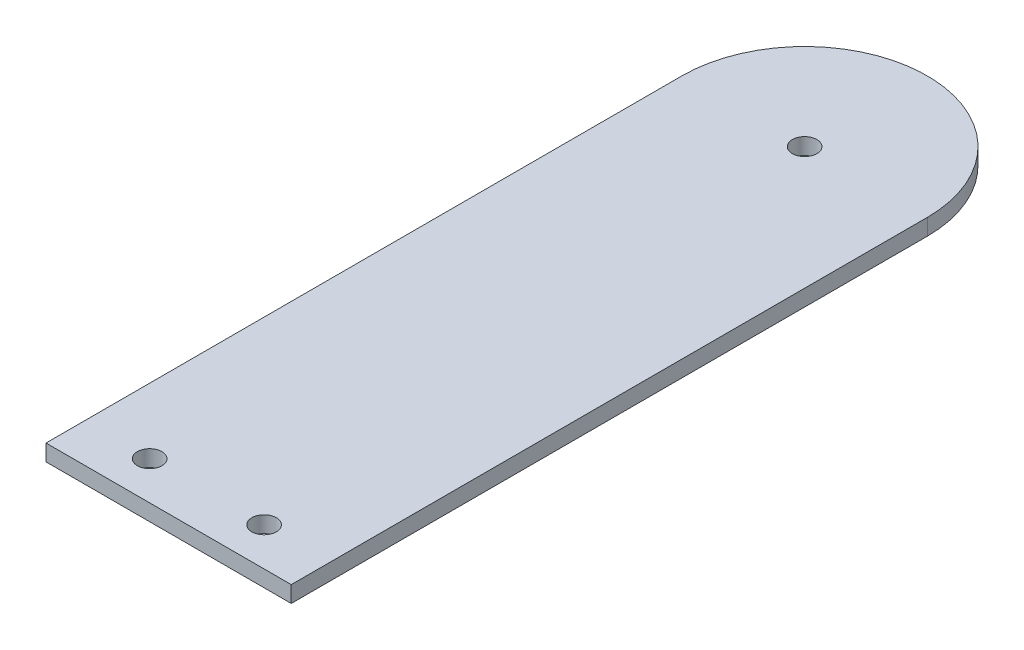
ISO-10303-21;
HEADER;
FILE_DESCRIPTION(('STEP AP214'),'2;1');
FILE_NAME('part.step','',(''),(''),'','','');
FILE_SCHEMA(('AUTOMOTIVE_DESIGN { 1 0 10303 214 1 1 1 1 }'));
ENDSEC;
DATA;
#1=APPLICATION_CONTEXT('core data for automotive mechanical design processes');
#2=APPLICATION_PROTOCOL_DEFINITION('international standard','automotive_design',2000,#1);
#3=PRODUCT_CONTEXT('',#1,'mechanical');
#4=PRODUCT('Part','Part','',(#3));
#5=PRODUCT_RELATED_PRODUCT_CATEGORY('part','',(#4));
#6=PRODUCT_DEFINITION_FORMATION('','',#4);
#7=PRODUCT_DEFINITION_CONTEXT('part definition',#1,'design');
#8=PRODUCT_DEFINITION('design','',#6,#7);
#9=PRODUCT_DEFINITION_SHAPE('','',#8);
#10=(LENGTH_UNIT() NAMED_UNIT(*) SI_UNIT(.MILLI.,.METRE.));
#11=(NAMED_UNIT(*) PLANE_ANGLE_UNIT() SI_UNIT($,.RADIAN.));
#12=(NAMED_UNIT(*) SI_UNIT($,.STERADIAN.) SOLID_ANGLE_UNIT());
#13=UNCERTAINTY_MEASURE_WITH_UNIT(LENGTH_MEASURE(1.E-05),#10,'distance_accuracy_value','');
#14=(GEOMETRIC_REPRESENTATION_CONTEXT(3) GLOBAL_UNCERTAINTY_ASSIGNED_CONTEXT((#13)) GLOBAL_UNIT_ASSIGNED_CONTEXT((#10,
#11,#12)) REPRESENTATION_CONTEXT('',''));
#15=CARTESIAN_POINT('',(0.,0.,0.));
#16=DIRECTION('',(0.,0.,1.));
#17=DIRECTION('',(1.,0.,0.));
#18=AXIS2_PLACEMENT_3D('',#15,#16,#17);
#19=CARTESIAN_POINT('',(-2.62522791540278,2.,-48.1827211912994));
#20=DIRECTION('',(0.,1.,0.));
#21=DIRECTION('',(0.,0.,1.));
#22=AXIS2_PLACEMENT_3D('',#19,#20,#21);
#23=PLANE('',#22);
#24=CARTESIAN_POINT('',(4.37477208459723,2.,24.9379456374754));
#25=DIRECTION('',(0.,1.,0.));
#26=DIRECTION('',(0.,0.,1.));
#27=AXIS2_PLACEMENT_3D('',#24,#25,#26);
#28=CIRCLE('',#27,1.5);
#29=CARTESIAN_POINT('',(4.37477208459723,2.,26.4379456374754));
#30=VERTEX_POINT('',#29);
#31=EDGE_CURVE('E117',#30,#30,#28,.T.);
#32=ORIENTED_EDGE('',*,*,#31,.F.);
#33=EDGE_LOOP('',(#32));
#34=FACE_BOUND('',#33,.T.);
#35=DIRECTION('',(0.,0.,1.));
#36=VECTOR('',#35,1.);
#37=CARTESIAN_POINT('',(-17.6252279154028,2.,29.6172788087006));
#38=LINE('',#37,#36);
#39=CARTESIAN_POINT('',(-17.6252279154028,2.,-48.1827211912994));
#40=VERTEX_POINT('',#39);
#41=CARTESIAN_POINT('',(-17.6252279154028,2.,29.6172788087006));
#42=VERTEX_POINT('',#41);
#43=EDGE_CURVE('E87',#40,#42,#38,.T.);
#44=ORIENTED_EDGE('',*,*,#43,.T.);
#45=DIRECTION('',(1.,0.,0.));
#46=VECTOR('',#45,1.);
#47=CARTESIAN_POINT('',(-17.6252279154028,2.,29.6172788087006));
#48=LINE('',#47,#46);
#49=CARTESIAN_POINT('',(12.3747720845972,2.,29.6172788087006));
#50=VERTEX_POINT('',#49);
#51=EDGE_CURVE('E82',#42,#50,#48,.T.);
#52=ORIENTED_EDGE('',*,*,#51,.T.);
#53=DIRECTION('',(0.,0.,-1.));
#54=VECTOR('',#53,1.);
#55=CARTESIAN_POINT('',(12.3747720845972,2.,29.6172788087006));
#56=LINE('',#55,#54);
#57=CARTESIAN_POINT('',(12.3747720845972,2.,-48.1827211912994));
#58=VERTEX_POINT('',#57);
#59=EDGE_CURVE('E85',#50,#58,#56,.T.);
#60=ORIENTED_EDGE('',*,*,#59,.T.);
#61=CARTESIAN_POINT('',(-2.62522791540278,2.,-48.1827211912994));
#62=DIRECTION('',(0.,1.,0.));
#63=DIRECTION('',(0.,0.,1.));
#64=AXIS2_PLACEMENT_3D('',#61,#62,#63);
#65=CIRCLE('',#64,15.);
#66=EDGE_CURVE('E52',#58,#40,#65,.T.);
#67=ORIENTED_EDGE('',*,*,#66,.T.);
#68=EDGE_LOOP('',(#44,#52,#60,#67));
#69=FACE_BOUND('',#68,.T.);
#70=CARTESIAN_POINT('',(-9.62522791540277,2.,24.9379456374754));
#71=DIRECTION('',(0.,1.,0.));
#72=DIRECTION('',(0.,0.,1.));
#73=AXIS2_PLACEMENT_3D('',#70,#71,#72);
#74=CIRCLE('',#73,1.5);
#75=CARTESIAN_POINT('',(-9.62522791540277,2.,26.4379456374754));
#76=VERTEX_POINT('',#75);
#77=EDGE_CURVE('E102',#76,#76,#74,.T.);
#78=ORIENTED_EDGE('',*,*,#77,.F.);
#79=EDGE_LOOP('',(#78));
#80=FACE_BOUND('',#79,.T.);
#81=CARTESIAN_POINT('',(-2.62522791540278,2.,-48.1827211912994));
#82=DIRECTION('',(0.,1.,0.));
#83=DIRECTION('',(0.,0.,1.));
#84=AXIS2_PLACEMENT_3D('',#81,#82,#83);
#85=CIRCLE('',#84,1.5);
#86=CARTESIAN_POINT('',(-2.62522791540278,2.,-46.6827211912994));
#87=VERTEX_POINT('',#86);
#88=EDGE_CURVE('E123',#87,#87,#85,.T.);
#89=ORIENTED_EDGE('',*,*,#88,.F.);
#90=EDGE_LOOP('',(#89));
#91=FACE_BOUND('',#90,.T.);
#92=ADVANCED_FACE('F35',(#34,#69,#80,#91),#23,.T.);
#93=CARTESIAN_POINT('',(-2.62522791540278,0.,-48.1827211912994));
#94=DIRECTION('',(0.,1.,0.));
#95=DIRECTION('',(0.,0.,1.));
#96=AXIS2_PLACEMENT_3D('',#93,#94,#95);
#97=PLANE('',#96);
#98=DIRECTION('',(0.,0.,1.));
#99=VECTOR('',#98,1.);
#100=CARTESIAN_POINT('',(-17.6252279154028,0.,29.6172788087006));
#101=LINE('',#100,#99);
#102=CARTESIAN_POINT('',(-17.6252279154028,0.,-48.1827211912994));
#103=VERTEX_POINT('',#102);
#104=CARTESIAN_POINT('',(-17.6252279154028,0.,29.6172788087006));
#105=VERTEX_POINT('',#104);
#106=EDGE_CURVE('E99',#103,#105,#101,.T.);
#107=ORIENTED_EDGE('',*,*,#106,.F.);
#108=CARTESIAN_POINT('',(-2.62522791540278,0.,-48.1827211912994));
#109=DIRECTION('',(0.,1.,0.));
#110=DIRECTION('',(0.,0.,1.));
#111=AXIS2_PLACEMENT_3D('',#108,#109,#110);
#112=CIRCLE('',#111,15.);
#113=CARTESIAN_POINT('',(12.3747720845972,0.,-48.1827211912994));
#114=VERTEX_POINT('',#113);
#115=EDGE_CURVE('E75',#114,#103,#112,.T.);
#116=ORIENTED_EDGE('',*,*,#115,.F.);
#117=DIRECTION('',(0.,0.,-1.));
#118=VECTOR('',#117,1.);
#119=CARTESIAN_POINT('',(12.3747720845972,0.,29.6172788087006));
#120=LINE('',#119,#118);
#121=CARTESIAN_POINT('',(12.3747720845972,0.,29.6172788087006));
#122=VERTEX_POINT('',#121);
#123=EDGE_CURVE('E69',#122,#114,#120,.T.);
#124=ORIENTED_EDGE('',*,*,#123,.F.);
#125=DIRECTION('',(1.,0.,0.));
#126=VECTOR('',#125,1.);
#127=CARTESIAN_POINT('',(-17.6252279154028,0.,29.6172788087006));
#128=LINE('',#127,#126);
#129=EDGE_CURVE('E91',#105,#122,#128,.T.);
#130=ORIENTED_EDGE('',*,*,#129,.F.);
#131=EDGE_LOOP('',(#107,#116,#124,#130));
#132=FACE_BOUND('',#131,.T.);
#133=CARTESIAN_POINT('',(-9.62522791540277,0.,24.9379456374754));
#134=DIRECTION('',(0.,1.,0.));
#135=DIRECTION('',(0.,0.,1.));
#136=AXIS2_PLACEMENT_3D('',#133,#134,#135);
#137=CIRCLE('',#136,1.5);
#138=CARTESIAN_POINT('',(-9.62522791540277,0.,26.4379456374754));
#139=VERTEX_POINT('',#138);
#140=EDGE_CURVE('E114',#139,#139,#137,.T.);
#141=ORIENTED_EDGE('',*,*,#140,.T.);
#142=EDGE_LOOP('',(#141));
#143=FACE_BOUND('',#142,.T.);
#144=CARTESIAN_POINT('',(4.37477208459723,0.,24.9379456374754));
#145=DIRECTION('',(0.,1.,0.));
#146=DIRECTION('',(0.,0.,1.));
#147=AXIS2_PLACEMENT_3D('',#144,#145,#146);
#148=CIRCLE('',#147,1.5);
#149=CARTESIAN_POINT('',(4.37477208459723,0.,26.4379456374754));
#150=VERTEX_POINT('',#149);
#151=EDGE_CURVE('E120',#150,#150,#148,.T.);
#152=ORIENTED_EDGE('',*,*,#151,.T.);
#153=EDGE_LOOP('',(#152));
#154=FACE_BOUND('',#153,.T.);
#155=CARTESIAN_POINT('',(-2.62522791540278,0.,-48.1827211912994));
#156=DIRECTION('',(0.,1.,0.));
#157=DIRECTION('',(0.,0.,1.));
#158=AXIS2_PLACEMENT_3D('',#155,#156,#157);
#159=CIRCLE('',#158,1.5);
#160=CARTESIAN_POINT('',(-2.62522791540278,0.,-46.6827211912994));
#161=VERTEX_POINT('',#160);
#162=EDGE_CURVE('E126',#161,#161,#159,.T.);
#163=ORIENTED_EDGE('',*,*,#162,.T.);
#164=EDGE_LOOP('',(#163));
#165=FACE_BOUND('',#164,.T.);
#166=ADVANCED_FACE('F110',(#132,#143,#154,#165),#97,.F.);
#167=CARTESIAN_POINT('',(-17.6252279154028,2.,29.6172788087006));
#168=DIRECTION('',(1.,0.,0.));
#169=DIRECTION('',(0.,0.,-1.));
#170=AXIS2_PLACEMENT_3D('',#167,#168,#169);
#171=PLANE('',#170);
#172=ORIENTED_EDGE('',*,*,#106,.T.);
#173=DIRECTION('',(0.,-1.,0.));
#174=VECTOR('',#173,1.);
#175=CARTESIAN_POINT('',(-17.6252279154028,2.,29.6172788087006));
#176=LINE('',#175,#174);
#177=EDGE_CURVE('E11',#42,#105,#176,.T.);
#178=ORIENTED_EDGE('',*,*,#177,.F.);
#179=ORIENTED_EDGE('',*,*,#43,.F.);
#180=DIRECTION('',(0.,-1.,0.));
#181=VECTOR('',#180,1.);
#182=CARTESIAN_POINT('',(-17.6252279154028,2.,-48.1827211912994));
#183=LINE('',#182,#181);
#184=EDGE_CURVE('E95',#40,#103,#183,.T.);
#185=ORIENTED_EDGE('',*,*,#184,.T.);
#186=EDGE_LOOP('',(#172,#178,#179,#185));
#187=FACE_BOUND('',#186,.T.);
#188=ADVANCED_FACE('F37',(#187),#171,.F.);
#189=CARTESIAN_POINT('',(-17.6252279154028,2.,29.6172788087006));
#190=DIRECTION('',(0.,0.,-1.));
#191=DIRECTION('',(-1.,0.,0.));
#192=AXIS2_PLACEMENT_3D('',#189,#190,#191);
#193=PLANE('',#192);
#194=ORIENTED_EDGE('',*,*,#129,.T.);
#195=DIRECTION('',(0.,-1.,0.));
#196=VECTOR('',#195,1.);
#197=CARTESIAN_POINT('',(12.3747720845972,2.,29.6172788087006));
#198=LINE('',#197,#196);
#199=EDGE_CURVE('E44',#50,#122,#198,.T.);
#200=ORIENTED_EDGE('',*,*,#199,.F.);
#201=ORIENTED_EDGE('',*,*,#51,.F.);
#202=ORIENTED_EDGE('',*,*,#177,.T.);
#203=EDGE_LOOP('',(#194,#200,#201,#202));
#204=FACE_BOUND('',#203,.T.);
#205=ADVANCED_FACE('F90',(#204),#193,.F.);
#206=CARTESIAN_POINT('',(12.3747720845972,2.,29.6172788087006));
#207=DIRECTION('',(-1.,0.,0.));
#208=DIRECTION('',(0.,0.,1.));
#209=AXIS2_PLACEMENT_3D('',#206,#207,#208);
#210=PLANE('',#209);
#211=ORIENTED_EDGE('',*,*,#123,.T.);
#212=DIRECTION('',(0.,-1.,0.));
#213=VECTOR('',#212,1.);
#214=CARTESIAN_POINT('',(12.3747720845972,2.,-48.1827211912994));
#215=LINE('',#214,#213);
#216=EDGE_CURVE('E92',#58,#114,#215,.T.);
#217=ORIENTED_EDGE('',*,*,#216,.F.);
#218=ORIENTED_EDGE('',*,*,#59,.F.);
#219=ORIENTED_EDGE('',*,*,#199,.T.);
#220=EDGE_LOOP('',(#211,#217,#218,#219));
#221=FACE_BOUND('',#220,.T.);
#222=ADVANCED_FACE('F93',(#221),#210,.F.);
#223=CARTESIAN_POINT('',(-2.62522791540278,2.,-48.1827211912994));
#224=DIRECTION('',(0.,-1.,0.));
#225=DIRECTION('',(0.,0.,-1.));
#226=AXIS2_PLACEMENT_3D('',#223,#224,#225);
#227=CYLINDRICAL_SURFACE('',#226,15.);
#228=ORIENTED_EDGE('',*,*,#115,.T.);
#229=ORIENTED_EDGE('',*,*,#184,.F.);
#230=ORIENTED_EDGE('',*,*,#66,.F.);
#231=ORIENTED_EDGE('',*,*,#216,.T.);
#232=EDGE_LOOP('',(#228,#229,#230,#231));
#233=FACE_BOUND('',#232,.T.);
#234=ADVANCED_FACE('F107',(#233),#227,.T.);
#235=CARTESIAN_POINT('',(-9.62522791540277,2.,24.9379456374754));
#236=DIRECTION('',(0.,-1.,0.));
#237=DIRECTION('',(0.,0.,-1.));
#238=AXIS2_PLACEMENT_3D('',#235,#236,#237);
#239=CYLINDRICAL_SURFACE('',#238,1.5);
#240=ORIENTED_EDGE('',*,*,#77,.T.);
#241=EDGE_LOOP('',(#240));
#242=FACE_BOUND('',#241,.T.);
#243=ORIENTED_EDGE('',*,*,#140,.F.);
#244=EDGE_LOOP('',(#243));
#245=FACE_BOUND('',#244,.T.);
#246=ADVANCED_FACE('F144',(#242,#245),#239,.F.);
#247=CARTESIAN_POINT('',(4.37477208459723,2.,24.9379456374754));
#248=DIRECTION('',(0.,-1.,0.));
#249=DIRECTION('',(0.,0.,-1.));
#250=AXIS2_PLACEMENT_3D('',#247,#248,#249);
#251=CYLINDRICAL_SURFACE('',#250,1.5);
#252=ORIENTED_EDGE('',*,*,#31,.T.);
#253=EDGE_LOOP('',(#252));
#254=FACE_BOUND('',#253,.T.);
#255=ORIENTED_EDGE('',*,*,#151,.F.);
#256=EDGE_LOOP('',(#255));
#257=FACE_BOUND('',#256,.T.);
#258=ADVANCED_FACE('F190',(#254,#257),#251,.F.);
#259=CARTESIAN_POINT('',(-2.62522791540278,2.,-48.1827211912994));
#260=DIRECTION('',(0.,-1.,0.));
#261=DIRECTION('',(0.,0.,-1.));
#262=AXIS2_PLACEMENT_3D('',#259,#260,#261);
#263=CYLINDRICAL_SURFACE('',#262,1.5);
#264=ORIENTED_EDGE('',*,*,#88,.T.);
#265=EDGE_LOOP('',(#264));
#266=FACE_BOUND('',#265,.T.);
#267=ORIENTED_EDGE('',*,*,#162,.F.);
#268=EDGE_LOOP('',(#267));
#269=FACE_BOUND('',#268,.T.);
#270=ADVANCED_FACE('F132',(#266,#269),#263,.F.);
#271=CLOSED_SHELL('',(#92,#166,#188,#205,#222,#234,#246,#258,#270));
#272=MANIFOLD_SOLID_BREP('B2',#271);
#273=ADVANCED_BREP_SHAPE_REPRESENTATION('',(#18,#272),#14);
#274=SHAPE_DEFINITION_REPRESENTATION(#9,#273);
ENDSEC;
END-ISO-10303-21;
